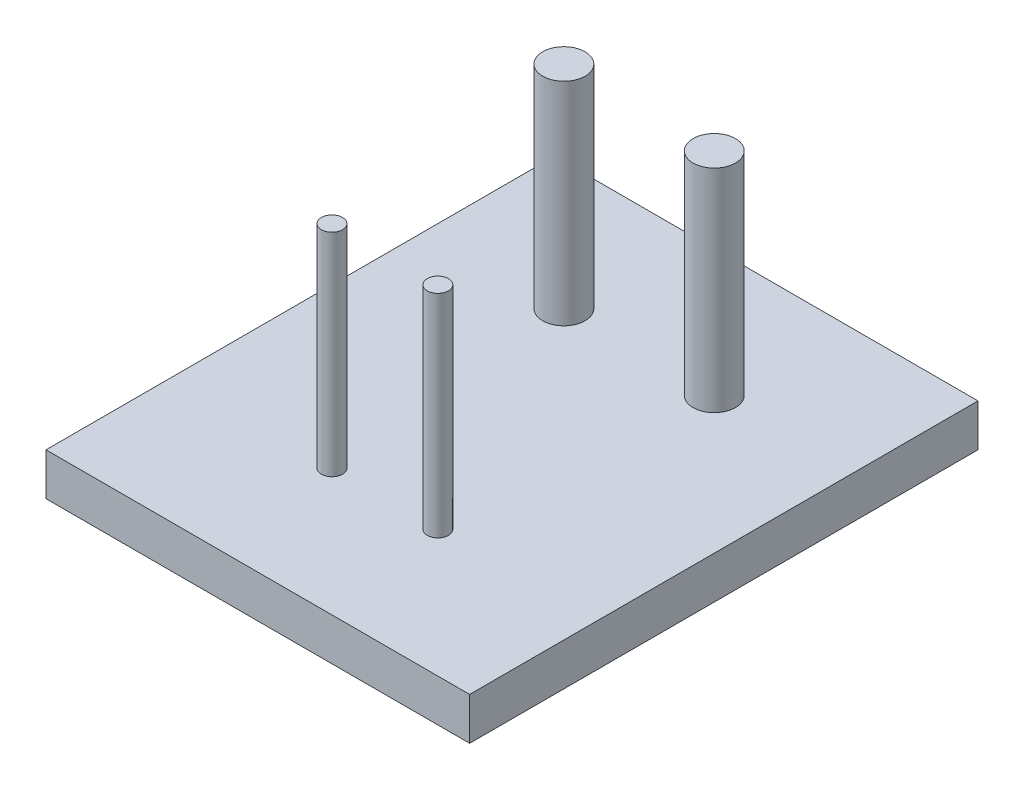
ISO-10303-21;
HEADER;
FILE_DESCRIPTION(('STEP AP214'),'2;1');
FILE_NAME('part.step','',(''),(''),'','','');
FILE_SCHEMA(('AUTOMOTIVE_DESIGN { 1 0 10303 214 1 1 1 1 }'));
ENDSEC;
DATA;
#1=APPLICATION_CONTEXT('core data for automotive mechanical design processes');
#2=APPLICATION_PROTOCOL_DEFINITION('international standard','automotive_design',2000,#1);
#3=PRODUCT_CONTEXT('',#1,'mechanical');
#4=PRODUCT('Part','Part','',(#3));
#5=PRODUCT_RELATED_PRODUCT_CATEGORY('part','',(#4));
#6=PRODUCT_DEFINITION_FORMATION('','',#4);
#7=PRODUCT_DEFINITION_CONTEXT('part definition',#1,'design');
#8=PRODUCT_DEFINITION('design','',#6,#7);
#9=PRODUCT_DEFINITION_SHAPE('','',#8);
#10=(LENGTH_UNIT() NAMED_UNIT(*) SI_UNIT(.MILLI.,.METRE.));
#11=(NAMED_UNIT(*) PLANE_ANGLE_UNIT() SI_UNIT($,.RADIAN.));
#12=(NAMED_UNIT(*) SI_UNIT($,.STERADIAN.) SOLID_ANGLE_UNIT());
#13=UNCERTAINTY_MEASURE_WITH_UNIT(LENGTH_MEASURE(1.E-05),#10,'distance_accuracy_value','');
#14=(GEOMETRIC_REPRESENTATION_CONTEXT(3) GLOBAL_UNCERTAINTY_ASSIGNED_CONTEXT((#13)) GLOBAL_UNIT_ASSIGNED_CONTEXT((#10,
#11,#12)) REPRESENTATION_CONTEXT('',''));
#15=CARTESIAN_POINT('',(0.,0.,0.));
#16=DIRECTION('',(0.,0.,1.));
#17=DIRECTION('',(1.,0.,0.));
#18=AXIS2_PLACEMENT_3D('',#15,#16,#17);
#19=CARTESIAN_POINT('',(-50.,5.,60.));
#20=DIRECTION('',(1.,0.,0.));
#21=DIRECTION('',(0.,0.,-1.));
#22=AXIS2_PLACEMENT_3D('',#19,#20,#21);
#23=PLANE('',#22);
#24=DIRECTION('',(0.,0.,1.));
#25=VECTOR('',#24,1.);
#26=CARTESIAN_POINT('',(-50.,-5.,60.));
#27=LINE('',#26,#25);
#28=CARTESIAN_POINT('',(-50.,-5.,-60.));
#29=VERTEX_POINT('',#28);
#30=CARTESIAN_POINT('',(-50.,-5.,60.));
#31=VERTEX_POINT('',#30);
#32=EDGE_CURVE('E111',#29,#31,#27,.T.);
#33=ORIENTED_EDGE('',*,*,#32,.T.);
#34=DIRECTION('',(0.,-1.,0.));
#35=VECTOR('',#34,1.);
#36=CARTESIAN_POINT('',(-50.,5.,60.));
#37=LINE('',#36,#35);
#38=CARTESIAN_POINT('',(-50.,5.,60.));
#39=VERTEX_POINT('',#38);
#40=EDGE_CURVE('E11',#39,#31,#37,.T.);
#41=ORIENTED_EDGE('',*,*,#40,.F.);
#42=DIRECTION('',(0.,0.,1.));
#43=VECTOR('',#42,1.);
#44=CARTESIAN_POINT('',(-50.,5.,60.));
#45=LINE('',#44,#43);
#46=CARTESIAN_POINT('',(-50.,5.,-60.));
#47=VERTEX_POINT('',#46);
#48=EDGE_CURVE('E95',#47,#39,#45,.T.);
#49=ORIENTED_EDGE('',*,*,#48,.F.);
#50=DIRECTION('',(0.,-1.,0.));
#51=VECTOR('',#50,1.);
#52=CARTESIAN_POINT('',(-50.,5.,-60.));
#53=LINE('',#52,#51);
#54=EDGE_CURVE('E107',#47,#29,#53,.T.);
#55=ORIENTED_EDGE('',*,*,#54,.T.);
#56=EDGE_LOOP('',(#33,#41,#49,#55));
#57=FACE_BOUND('',#56,.T.);
#58=ADVANCED_FACE('F43',(#57),#23,.F.);
#59=CARTESIAN_POINT('',(50.,5.,60.));
#60=DIRECTION('',(0.,0.,-1.));
#61=DIRECTION('',(-1.,0.,0.));
#62=AXIS2_PLACEMENT_3D('',#59,#60,#61);
#63=PLANE('',#62);
#64=DIRECTION('',(1.,0.,0.));
#65=VECTOR('',#64,1.);
#66=CARTESIAN_POINT('',(50.,-5.,60.));
#67=LINE('',#66,#65);
#68=CARTESIAN_POINT('',(50.,-5.,60.));
#69=VERTEX_POINT('',#68);
#70=EDGE_CURVE('E100',#31,#69,#67,.T.);
#71=ORIENTED_EDGE('',*,*,#70,.T.);
#72=DIRECTION('',(0.,-1.,0.));
#73=VECTOR('',#72,1.);
#74=CARTESIAN_POINT('',(50.,5.,60.));
#75=LINE('',#74,#73);
#76=CARTESIAN_POINT('',(50.,5.,60.));
#77=VERTEX_POINT('',#76);
#78=EDGE_CURVE('E52',#77,#69,#75,.T.);
#79=ORIENTED_EDGE('',*,*,#78,.F.);
#80=DIRECTION('',(1.,0.,0.));
#81=VECTOR('',#80,1.);
#82=CARTESIAN_POINT('',(50.,5.,60.));
#83=LINE('',#82,#81);
#84=EDGE_CURVE('E90',#39,#77,#83,.T.);
#85=ORIENTED_EDGE('',*,*,#84,.F.);
#86=ORIENTED_EDGE('',*,*,#40,.T.);
#87=EDGE_LOOP('',(#71,#79,#85,#86));
#88=FACE_BOUND('',#87,.T.);
#89=ADVANCED_FACE('F99',(#88),#63,.F.);
#90=CARTESIAN_POINT('',(50.,5.,60.));
#91=DIRECTION('',(-1.,0.,0.));
#92=DIRECTION('',(0.,0.,1.));
#93=AXIS2_PLACEMENT_3D('',#90,#91,#92);
#94=PLANE('',#93);
#95=DIRECTION('',(0.,0.,-1.));
#96=VECTOR('',#95,1.);
#97=CARTESIAN_POINT('',(50.,-5.,60.));
#98=LINE('',#97,#96);
#99=CARTESIAN_POINT('',(50.,-5.,-60.));
#100=VERTEX_POINT('',#99);
#101=EDGE_CURVE('E77',#69,#100,#98,.T.);
#102=ORIENTED_EDGE('',*,*,#101,.T.);
#103=DIRECTION('',(0.,-1.,0.));
#104=VECTOR('',#103,1.);
#105=CARTESIAN_POINT('',(50.,5.,-60.));
#106=LINE('',#105,#104);
#107=CARTESIAN_POINT('',(50.,5.,-60.));
#108=VERTEX_POINT('',#107);
#109=EDGE_CURVE('E102',#108,#100,#106,.T.);
#110=ORIENTED_EDGE('',*,*,#109,.F.);
#111=DIRECTION('',(0.,0.,-1.));
#112=VECTOR('',#111,1.);
#113=CARTESIAN_POINT('',(50.,5.,60.));
#114=LINE('',#113,#112);
#115=EDGE_CURVE('E93',#77,#108,#114,.T.);
#116=ORIENTED_EDGE('',*,*,#115,.F.);
#117=ORIENTED_EDGE('',*,*,#78,.T.);
#118=EDGE_LOOP('',(#102,#110,#116,#117));
#119=FACE_BOUND('',#118,.T.);
#120=ADVANCED_FACE('F103',(#119),#94,.F.);
#121=CARTESIAN_POINT('',(50.,5.,-60.));
#122=DIRECTION('',(0.,0.,1.));
#123=DIRECTION('',(1.,0.,0.));
#124=AXIS2_PLACEMENT_3D('',#121,#122,#123);
#125=PLANE('',#124);
#126=DIRECTION('',(-1.,0.,0.));
#127=VECTOR('',#126,1.);
#128=CARTESIAN_POINT('',(50.,-5.,-60.));
#129=LINE('',#128,#127);
#130=EDGE_CURVE('E83',#100,#29,#129,.T.);
#131=ORIENTED_EDGE('',*,*,#130,.T.);
#132=ORIENTED_EDGE('',*,*,#54,.F.);
#133=DIRECTION('',(-1.,0.,0.));
#134=VECTOR('',#133,1.);
#135=CARTESIAN_POINT('',(50.,5.,-60.));
#136=LINE('',#135,#134);
#137=EDGE_CURVE('E60',#108,#47,#136,.T.);
#138=ORIENTED_EDGE('',*,*,#137,.F.);
#139=ORIENTED_EDGE('',*,*,#109,.T.);
#140=EDGE_LOOP('',(#131,#132,#138,#139));
#141=FACE_BOUND('',#140,.T.);
#142=ADVANCED_FACE('F125',(#141),#125,.F.);
#143=CARTESIAN_POINT('',(0.,5.,0.));
#144=DIRECTION('',(0.,1.,0.));
#145=DIRECTION('',(0.,0.,1.));
#146=AXIS2_PLACEMENT_3D('',#143,#144,#145);
#147=PLANE('',#146);
#148=CARTESIAN_POINT('',(-12.5,5.,30.));
#149=DIRECTION('',(0.,1.,0.));
#150=DIRECTION('',(0.,0.,1.));
#151=AXIS2_PLACEMENT_3D('',#148,#149,#150);
#152=CIRCLE('',#151,2.5);
#153=CARTESIAN_POINT('',(-12.5,5.,32.5));
#154=VERTEX_POINT('',#153);
#155=EDGE_CURVE('E152',#154,#154,#152,.T.);
#156=ORIENTED_EDGE('',*,*,#155,.F.);
#157=EDGE_LOOP('',(#156));
#158=FACE_BOUND('',#157,.T.);
#159=CARTESIAN_POINT('',(12.5,5.,30.));
#160=DIRECTION('',(0.,1.,0.));
#161=DIRECTION('',(0.,0.,1.));
#162=AXIS2_PLACEMENT_3D('',#159,#160,#161);
#163=CIRCLE('',#162,2.5);
#164=CARTESIAN_POINT('',(12.5,5.,32.5));
#165=VERTEX_POINT('',#164);
#166=EDGE_CURVE('E144',#165,#165,#163,.T.);
#167=ORIENTED_EDGE('',*,*,#166,.F.);
#168=EDGE_LOOP('',(#167));
#169=FACE_BOUND('',#168,.T.);
#170=CARTESIAN_POINT('',(17.75,5.,-30.));
#171=DIRECTION('',(0.,1.,0.));
#172=DIRECTION('',(0.,0.,-1.));
#173=AXIS2_PLACEMENT_3D('',#170,#171,#172);
#174=CIRCLE('',#173,5.00000000000001);
#175=CARTESIAN_POINT('',(17.75,5.,-35.));
#176=VERTEX_POINT('',#175);
#177=EDGE_CURVE('E136',#176,#176,#174,.T.);
#178=ORIENTED_EDGE('',*,*,#177,.F.);
#179=EDGE_LOOP('',(#178));
#180=FACE_BOUND('',#179,.T.);
#181=CARTESIAN_POINT('',(-17.75,5.,-30.));
#182=DIRECTION('',(0.,1.,0.));
#183=DIRECTION('',(0.,0.,1.));
#184=AXIS2_PLACEMENT_3D('',#181,#182,#183);
#185=CIRCLE('',#184,5.);
#186=CARTESIAN_POINT('',(-17.75,5.,-25.));
#187=VERTEX_POINT('',#186);
#188=EDGE_CURVE('E132',#187,#187,#185,.T.);
#189=ORIENTED_EDGE('',*,*,#188,.F.);
#190=EDGE_LOOP('',(#189));
#191=FACE_BOUND('',#190,.T.);
#192=ORIENTED_EDGE('',*,*,#48,.T.);
#193=ORIENTED_EDGE('',*,*,#84,.T.);
#194=ORIENTED_EDGE('',*,*,#115,.T.);
#195=ORIENTED_EDGE('',*,*,#137,.T.);
#196=EDGE_LOOP('',(#192,#193,#194,#195));
#197=FACE_BOUND('',#196,.T.);
#198=ADVANCED_FACE('F91',(#158,#169,#180,#191,#197),#147,.T.);
#199=CARTESIAN_POINT('',(0.,-5.,0.));
#200=DIRECTION('',(0.,1.,0.));
#201=DIRECTION('',(0.,0.,1.));
#202=AXIS2_PLACEMENT_3D('',#199,#200,#201);
#203=PLANE('',#202);
#204=ORIENTED_EDGE('',*,*,#32,.F.);
#205=ORIENTED_EDGE('',*,*,#130,.F.);
#206=ORIENTED_EDGE('',*,*,#101,.F.);
#207=ORIENTED_EDGE('',*,*,#70,.F.);
#208=EDGE_LOOP('',(#204,#205,#206,#207));
#209=FACE_BOUND('',#208,.T.);
#210=ADVANCED_FACE('F128',(#209),#203,.F.);
#211=CARTESIAN_POINT('',(-17.75,55.,-30.));
#212=DIRECTION('',(0.,-1.,0.));
#213=DIRECTION('',(0.,0.,-1.));
#214=AXIS2_PLACEMENT_3D('',#211,#212,#213);
#215=CYLINDRICAL_SURFACE('',#214,5.);
#216=CARTESIAN_POINT('',(-17.75,55.,-30.));
#217=DIRECTION('',(0.,1.,0.));
#218=DIRECTION('',(0.,0.,1.));
#219=AXIS2_PLACEMENT_3D('',#216,#217,#218);
#220=CIRCLE('',#219,5.);
#221=CARTESIAN_POINT('',(-17.75,55.,-25.));
#222=VERTEX_POINT('',#221);
#223=EDGE_CURVE('E115',#222,#222,#220,.T.);
#224=ORIENTED_EDGE('',*,*,#223,.F.);
#225=EDGE_LOOP('',(#224));
#226=FACE_BOUND('',#225,.T.);
#227=ORIENTED_EDGE('',*,*,#188,.T.);
#228=EDGE_LOOP('',(#227));
#229=FACE_BOUND('',#228,.T.);
#230=ADVANCED_FACE('F175',(#226,#229),#215,.T.);
#231=CARTESIAN_POINT('',(-17.75,55.,-30.));
#232=DIRECTION('',(0.,1.,0.));
#233=DIRECTION('',(0.,0.,1.));
#234=AXIS2_PLACEMENT_3D('',#231,#232,#233);
#235=PLANE('',#234);
#236=ORIENTED_EDGE('',*,*,#223,.T.);
#237=EDGE_LOOP('',(#236));
#238=FACE_BOUND('',#237,.T.);
#239=ADVANCED_FACE('F177',(#238),#235,.T.);
#240=CARTESIAN_POINT('',(17.75,55.,-30.));
#241=DIRECTION('',(0.,-1.,0.));
#242=DIRECTION('',(0.,0.,-1.));
#243=AXIS2_PLACEMENT_3D('',#240,#241,#242);
#244=CYLINDRICAL_SURFACE('',#243,5.00000000000001);
#245=CARTESIAN_POINT('',(17.75,55.,-30.));
#246=DIRECTION('',(0.,1.,0.));
#247=DIRECTION('',(0.,0.,-1.));
#248=AXIS2_PLACEMENT_3D('',#245,#246,#247);
#249=CIRCLE('',#248,5.00000000000001);
#250=CARTESIAN_POINT('',(17.75,55.,-35.));
#251=VERTEX_POINT('',#250);
#252=EDGE_CURVE('E140',#251,#251,#249,.T.);
#253=ORIENTED_EDGE('',*,*,#252,.F.);
#254=EDGE_LOOP('',(#253));
#255=FACE_BOUND('',#254,.T.);
#256=ORIENTED_EDGE('',*,*,#177,.T.);
#257=EDGE_LOOP('',(#256));
#258=FACE_BOUND('',#257,.T.);
#259=ADVANCED_FACE('F184',(#255,#258),#244,.T.);
#260=CARTESIAN_POINT('',(17.75,55.,-30.));
#261=DIRECTION('',(0.,-1.,0.));
#262=DIRECTION('',(0.,0.,-1.));
#263=AXIS2_PLACEMENT_3D('',#260,#261,#262);
#264=PLANE('',#263);
#265=ORIENTED_EDGE('',*,*,#252,.T.);
#266=EDGE_LOOP('',(#265));
#267=FACE_BOUND('',#266,.T.);
#268=ADVANCED_FACE('F240',(#267),#264,.F.);
#269=CARTESIAN_POINT('',(12.5,55.,30.));
#270=DIRECTION('',(0.,-1.,0.));
#271=DIRECTION('',(0.,0.,-1.));
#272=AXIS2_PLACEMENT_3D('',#269,#270,#271);
#273=CYLINDRICAL_SURFACE('',#272,2.5);
#274=CARTESIAN_POINT('',(12.5,55.,30.));
#275=DIRECTION('',(0.,1.,0.));
#276=DIRECTION('',(0.,0.,1.));
#277=AXIS2_PLACEMENT_3D('',#274,#275,#276);
#278=CIRCLE('',#277,2.5);
#279=CARTESIAN_POINT('',(12.5,55.,32.5));
#280=VERTEX_POINT('',#279);
#281=EDGE_CURVE('E148',#280,#280,#278,.T.);
#282=ORIENTED_EDGE('',*,*,#281,.F.);
#283=EDGE_LOOP('',(#282));
#284=FACE_BOUND('',#283,.T.);
#285=ORIENTED_EDGE('',*,*,#166,.T.);
#286=EDGE_LOOP('',(#285));
#287=FACE_BOUND('',#286,.T.);
#288=ADVANCED_FACE('F251',(#284,#287),#273,.T.);
#289=CARTESIAN_POINT('',(12.5,55.,30.));
#290=DIRECTION('',(0.,1.,0.));
#291=DIRECTION('',(0.,0.,1.));
#292=AXIS2_PLACEMENT_3D('',#289,#290,#291);
#293=PLANE('',#292);
#294=ORIENTED_EDGE('',*,*,#281,.T.);
#295=EDGE_LOOP('',(#294));
#296=FACE_BOUND('',#295,.T.);
#297=ADVANCED_FACE('F262',(#296),#293,.T.);
#298=CARTESIAN_POINT('',(-12.5,55.,30.));
#299=DIRECTION('',(0.,-1.,0.));
#300=DIRECTION('',(0.,0.,-1.));
#301=AXIS2_PLACEMENT_3D('',#298,#299,#300);
#302=CYLINDRICAL_SURFACE('',#301,2.5);
#303=CARTESIAN_POINT('',(-12.5,55.,30.));
#304=DIRECTION('',(0.,1.,0.));
#305=DIRECTION('',(0.,0.,1.));
#306=AXIS2_PLACEMENT_3D('',#303,#304,#305);
#307=CIRCLE('',#306,2.5);
#308=CARTESIAN_POINT('',(-12.5,55.,32.5));
#309=VERTEX_POINT('',#308);
#310=EDGE_CURVE('E156',#309,#309,#307,.T.);
#311=ORIENTED_EDGE('',*,*,#310,.F.);
#312=EDGE_LOOP('',(#311));
#313=FACE_BOUND('',#312,.T.);
#314=ORIENTED_EDGE('',*,*,#155,.T.);
#315=EDGE_LOOP('',(#314));
#316=FACE_BOUND('',#315,.T.);
#317=ADVANCED_FACE('F164',(#313,#316),#302,.T.);
#318=CARTESIAN_POINT('',(-12.5,55.,30.));
#319=DIRECTION('',(0.,1.,0.));
#320=DIRECTION('',(0.,0.,1.));
#321=AXIS2_PLACEMENT_3D('',#318,#319,#320);
#322=PLANE('',#321);
#323=ORIENTED_EDGE('',*,*,#310,.T.);
#324=EDGE_LOOP('',(#323));
#325=FACE_BOUND('',#324,.T.);
#326=ADVANCED_FACE('F283',(#325),#322,.T.);
#327=CLOSED_SHELL('',(#58,#89,#120,#142,#198,#210,#230,#239,#259,#268,#288,#297,#317,#326));
#328=MANIFOLD_SOLID_BREP('B2',#327);
#329=ADVANCED_BREP_SHAPE_REPRESENTATION('',(#18,#328),#14);
#330=SHAPE_DEFINITION_REPRESENTATION(#9,#329);
ENDSEC;
END-ISO-10303-21;
